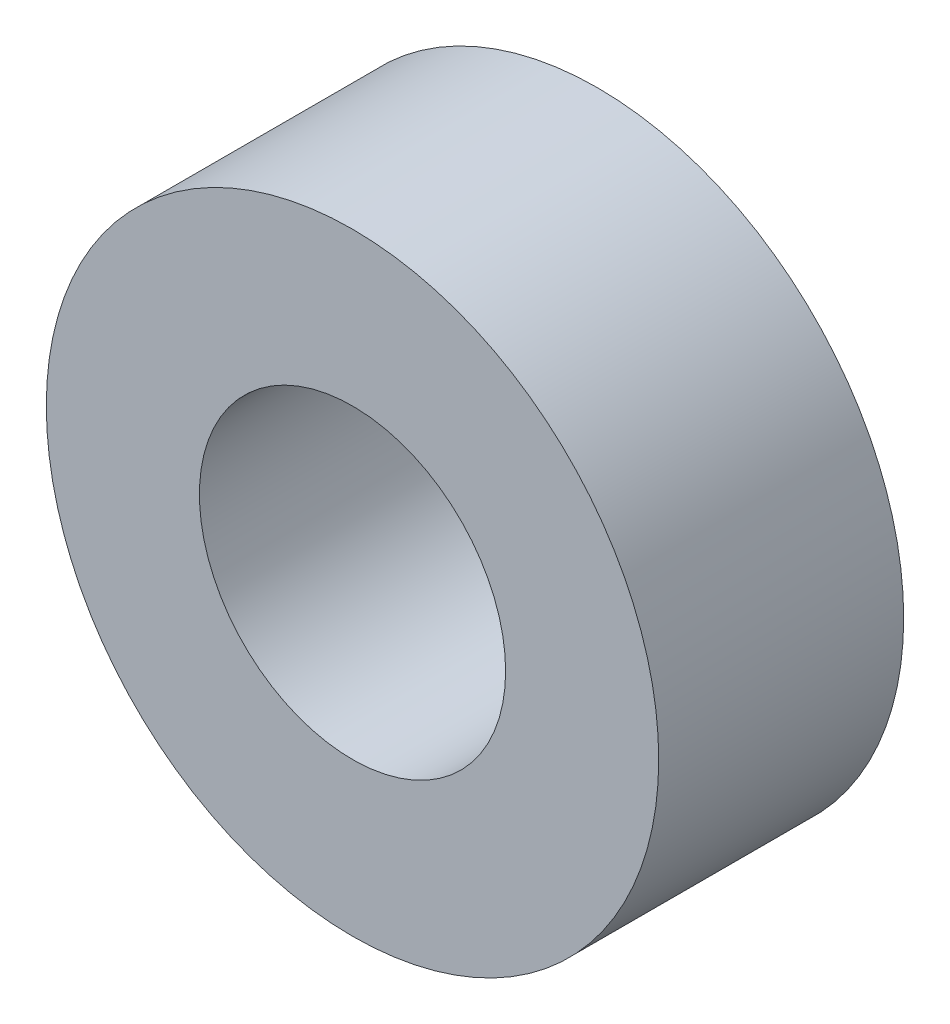
ISO-10303-21;
HEADER;
FILE_DESCRIPTION(('STEP AP214'),'2;1');
FILE_NAME('part.step','',(''),(''),'','','');
FILE_SCHEMA(('AUTOMOTIVE_DESIGN { 1 0 10303 214 1 1 1 1 }'));
ENDSEC;
DATA;
#1=APPLICATION_CONTEXT('core data for automotive mechanical design processes');
#2=APPLICATION_PROTOCOL_DEFINITION('international standard','automotive_design',2000,#1);
#3=PRODUCT_CONTEXT('',#1,'mechanical');
#4=PRODUCT('Part','Part','',(#3));
#5=PRODUCT_RELATED_PRODUCT_CATEGORY('part','',(#4));
#6=PRODUCT_DEFINITION_FORMATION('','',#4);
#7=PRODUCT_DEFINITION_CONTEXT('part definition',#1,'design');
#8=PRODUCT_DEFINITION('design','',#6,#7);
#9=PRODUCT_DEFINITION_SHAPE('','',#8);
#10=(LENGTH_UNIT() NAMED_UNIT(*) SI_UNIT(.MILLI.,.METRE.));
#11=(NAMED_UNIT(*) PLANE_ANGLE_UNIT() SI_UNIT($,.RADIAN.));
#12=(NAMED_UNIT(*) SI_UNIT($,.STERADIAN.) SOLID_ANGLE_UNIT());
#13=UNCERTAINTY_MEASURE_WITH_UNIT(LENGTH_MEASURE(1.E-05),#10,'distance_accuracy_value','');
#14=(GEOMETRIC_REPRESENTATION_CONTEXT(3) GLOBAL_UNCERTAINTY_ASSIGNED_CONTEXT((#13)) GLOBAL_UNIT_ASSIGNED_CONTEXT((#10,
#11,#12)) REPRESENTATION_CONTEXT('',''));
#15=CARTESIAN_POINT('',(0.,0.,0.));
#16=DIRECTION('',(0.,0.,1.));
#17=DIRECTION('',(1.,0.,0.));
#18=AXIS2_PLACEMENT_3D('',#15,#16,#17);
#19=CARTESIAN_POINT('',(0.,0.,4.));
#20=DIRECTION('',(0.,0.,1.));
#21=DIRECTION('',(1.,0.,0.));
#22=AXIS2_PLACEMENT_3D('',#19,#20,#21);
#23=PLANE('',#22);
#24=CARTESIAN_POINT('',(0.,0.,4.));
#25=DIRECTION('',(0.,0.,1.));
#26=DIRECTION('',(1.,0.,0.));
#27=AXIS2_PLACEMENT_3D('',#24,#25,#26);
#28=CIRCLE('',#27,5.);
#29=CARTESIAN_POINT('',(5.,0.,4.));
#30=VERTEX_POINT('',#29);
#31=EDGE_CURVE('E10',#30,#30,#28,.T.);
#32=ORIENTED_EDGE('',*,*,#31,.T.);
#33=EDGE_LOOP('',(#32));
#34=FACE_BOUND('',#33,.T.);
#35=CARTESIAN_POINT('',(0.,0.,4.));
#36=DIRECTION('',(0.,0.,1.));
#37=DIRECTION('',(1.,0.,0.));
#38=AXIS2_PLACEMENT_3D('',#35,#36,#37);
#39=CIRCLE('',#38,2.5);
#40=CARTESIAN_POINT('',(2.5,0.,4.));
#41=VERTEX_POINT('',#40);
#42=EDGE_CURVE('E42',#41,#41,#39,.T.);
#43=ORIENTED_EDGE('',*,*,#42,.F.);
#44=EDGE_LOOP('',(#43));
#45=FACE_BOUND('',#44,.T.);
#46=ADVANCED_FACE('F31',(#34,#45),#23,.T.);
#47=CARTESIAN_POINT('',(0.,0.,0.));
#48=DIRECTION('',(0.,0.,1.));
#49=DIRECTION('',(1.,0.,0.));
#50=AXIS2_PLACEMENT_3D('',#47,#48,#49);
#51=PLANE('',#50);
#52=CARTESIAN_POINT('',(0.,0.,0.));
#53=DIRECTION('',(0.,0.,1.));
#54=DIRECTION('',(1.,0.,0.));
#55=AXIS2_PLACEMENT_3D('',#52,#53,#54);
#56=CIRCLE('',#55,5.);
#57=CARTESIAN_POINT('',(5.,0.,0.));
#58=VERTEX_POINT('',#57);
#59=EDGE_CURVE('E35',#58,#58,#56,.T.);
#60=ORIENTED_EDGE('',*,*,#59,.F.);
#61=EDGE_LOOP('',(#60));
#62=FACE_BOUND('',#61,.T.);
#63=CARTESIAN_POINT('',(0.,0.,0.));
#64=DIRECTION('',(0.,0.,1.));
#65=DIRECTION('',(1.,0.,0.));
#66=AXIS2_PLACEMENT_3D('',#63,#64,#65);
#67=CIRCLE('',#66,2.5);
#68=CARTESIAN_POINT('',(2.5,0.,0.));
#69=VERTEX_POINT('',#68);
#70=EDGE_CURVE('E44',#69,#69,#67,.T.);
#71=ORIENTED_EDGE('',*,*,#70,.T.);
#72=EDGE_LOOP('',(#71));
#73=FACE_BOUND('',#72,.T.);
#74=ADVANCED_FACE('F54',(#62,#73),#51,.F.);
#75=CARTESIAN_POINT('',(0.,0.,4.));
#76=DIRECTION('',(0.,0.,-1.));
#77=DIRECTION('',(-1.,0.,0.));
#78=AXIS2_PLACEMENT_3D('',#75,#76,#77);
#79=CYLINDRICAL_SURFACE('',#78,5.);
#80=ORIENTED_EDGE('',*,*,#31,.F.);
#81=EDGE_LOOP('',(#80));
#82=FACE_BOUND('',#81,.T.);
#83=ORIENTED_EDGE('',*,*,#59,.T.);
#84=EDGE_LOOP('',(#83));
#85=FACE_BOUND('',#84,.T.);
#86=ADVANCED_FACE('F33',(#82,#85),#79,.T.);
#87=CARTESIAN_POINT('',(0.,0.,4.));
#88=DIRECTION('',(0.,0.,-1.));
#89=DIRECTION('',(-1.,0.,0.));
#90=AXIS2_PLACEMENT_3D('',#87,#88,#89);
#91=CYLINDRICAL_SURFACE('',#90,2.5);
#92=ORIENTED_EDGE('',*,*,#42,.T.);
#93=EDGE_LOOP('',(#92));
#94=FACE_BOUND('',#93,.T.);
#95=ORIENTED_EDGE('',*,*,#70,.F.);
#96=EDGE_LOOP('',(#95));
#97=FACE_BOUND('',#96,.T.);
#98=ADVANCED_FACE('F50',(#94,#97),#91,.F.);
#99=CLOSED_SHELL('',(#46,#74,#86,#98));
#100=MANIFOLD_SOLID_BREP('B2',#99);
#101=ADVANCED_BREP_SHAPE_REPRESENTATION('',(#18,#100),#14);
#102=SHAPE_DEFINITION_REPRESENTATION(#9,#101);
ENDSEC;
END-ISO-10303-21;
